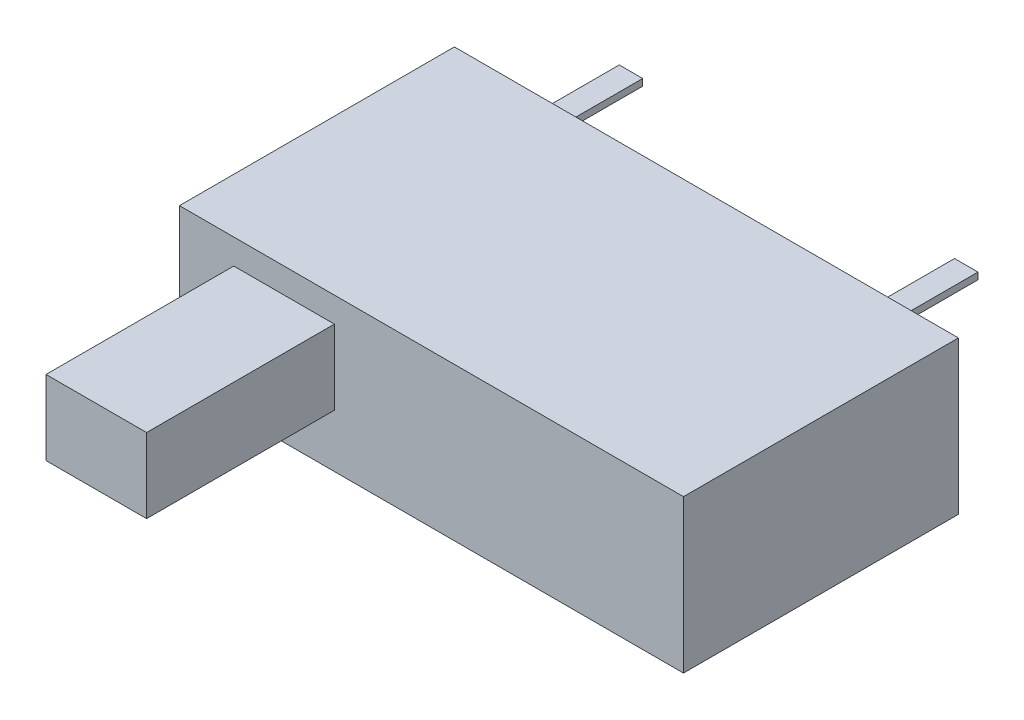
ISO-10303-21;
HEADER;
FILE_DESCRIPTION(('STEP AP214'),'2;1');
FILE_NAME('part.step','',(''),(''),'','','');
FILE_SCHEMA(('AUTOMOTIVE_DESIGN { 1 0 10303 214 1 1 1 1 }'));
ENDSEC;
DATA;
#1=APPLICATION_CONTEXT('core data for automotive mechanical design processes');
#2=APPLICATION_PROTOCOL_DEFINITION('international standard','automotive_design',2000,#1);
#3=PRODUCT_CONTEXT('',#1,'mechanical');
#4=PRODUCT('Part','Part','',(#3));
#5=PRODUCT_RELATED_PRODUCT_CATEGORY('part','',(#4));
#6=PRODUCT_DEFINITION_FORMATION('','',#4);
#7=PRODUCT_DEFINITION_CONTEXT('part definition',#1,'design');
#8=PRODUCT_DEFINITION('design','',#6,#7);
#9=PRODUCT_DEFINITION_SHAPE('','',#8);
#10=(LENGTH_UNIT() NAMED_UNIT(*) SI_UNIT(.MILLI.,.METRE.));
#11=(NAMED_UNIT(*) PLANE_ANGLE_UNIT() SI_UNIT($,.RADIAN.));
#12=(NAMED_UNIT(*) SI_UNIT($,.STERADIAN.) SOLID_ANGLE_UNIT());
#13=UNCERTAINTY_MEASURE_WITH_UNIT(LENGTH_MEASURE(1.E-05),#10,'distance_accuracy_value','');
#14=(GEOMETRIC_REPRESENTATION_CONTEXT(3) GLOBAL_UNCERTAINTY_ASSIGNED_CONTEXT((#13)) GLOBAL_UNIT_ASSIGNED_CONTEXT((#10,
#11,#12)) REPRESENTATION_CONTEXT('',''));
#15=CARTESIAN_POINT('',(0.,0.,0.));
#16=DIRECTION('',(0.,0.,1.));
#17=DIRECTION('',(1.,0.,0.));
#18=AXIS2_PLACEMENT_3D('',#15,#16,#17);
#19=CARTESIAN_POINT('',(13.4366000007917,29.2823899973672,-0.780745999724671));
#20=DIRECTION('',(-1.,5.89793348174388E-10,0.));
#21=DIRECTION('',(-5.89793348174388E-10,-1.,0.));
#22=AXIS2_PLACEMENT_3D('',#19,#20,#21);
#23=PLANE('',#22);
#24=DIRECTION('',(0.,-2.05103428515331E-10,1.));
#25=VECTOR('',#24,1.);
#26=CARTESIAN_POINT('',(13.4366000007917,29.2823899973671,-0.780745999724671));
#27=LINE('',#26,#25);
#28=CARTESIAN_POINT('',(13.4366000008217,29.2823899970806,2.01325400027533));
#29=VERTEX_POINT('',#28);
#30=CARTESIAN_POINT('',(13.4366000008217,29.2823899973672,-0.780745999703833));
#31=VERTEX_POINT('',#30);
#32=EDGE_CURVE('E155',#29,#31,#27,.F.);
#33=ORIENTED_EDGE('',*,*,#32,.T.);
#34=DIRECTION('',(0.,1.,2.05103428515331E-10));
#35=VECTOR('',#34,1.);
#36=CARTESIAN_POINT('',(13.4366000009116,29.4855899977866,-0.780745999682994));
#37=LINE('',#36,#35);
#38=CARTESIAN_POINT('',(13.4366000009116,29.4855899974336,-0.780745999682994));
#39=VERTEX_POINT('',#38);
#40=EDGE_CURVE('E149',#39,#31,#37,.F.);
#41=ORIENTED_EDGE('',*,*,#40,.F.);
#42=DIRECTION('',(0.,-2.05103428515331E-10,1.));
#43=VECTOR('',#42,1.);
#44=CARTESIAN_POINT('',(13.4366000009116,29.4855899973671,-0.780745999682994));
#45=LINE('',#44,#43);
#46=CARTESIAN_POINT('',(13.4366000009116,29.485589996899,2.01325400029617));
#47=VERTEX_POINT('',#46);
#48=EDGE_CURVE('E158',#39,#47,#45,.T.);
#49=ORIENTED_EDGE('',*,*,#48,.T.);
#50=DIRECTION('',(-5.89793348174388E-10,-1.,0.));
#51=VECTOR('',#50,1.);
#52=CARTESIAN_POINT('',(13.4366000007917,29.2823899973672,2.01325400027533));
#53=LINE('',#52,#51);
#54=EDGE_CURVE('E20',#29,#47,#53,.F.);
#55=ORIENTED_EDGE('',*,*,#54,.F.);
#56=EDGE_LOOP('',(#33,#41,#49,#55));
#57=FACE_BOUND('',#56,.T.);
#58=ADVANCED_FACE('F17',(#57),#23,.F.);
#59=CARTESIAN_POINT('',(3.27660000079173,29.2823900033595,-0.780745999724671));
#60=DIRECTION('',(-1.,5.89793348174388E-10,0.));
#61=DIRECTION('',(-5.89793348174388E-10,-1.,0.));
#62=AXIS2_PLACEMENT_3D('',#59,#60,#61);
#63=PLANE('',#62);
#64=DIRECTION('',(0.,-2.05103428515331E-10,1.));
#65=VECTOR('',#64,1.);
#66=CARTESIAN_POINT('',(3.27660000079173,29.2823900033594,-0.780745999724671));
#67=LINE('',#66,#65);
#68=CARTESIAN_POINT('',(3.27660000082169,29.2823900030729,2.01325400027533));
#69=VERTEX_POINT('',#68);
#70=CARTESIAN_POINT('',(3.27660000082169,29.2823900033595,-0.780745999703833));
#71=VERTEX_POINT('',#70);
#72=EDGE_CURVE('E211',#69,#71,#67,.F.);
#73=ORIENTED_EDGE('',*,*,#72,.T.);
#74=DIRECTION('',(0.,1.,2.05103428515331E-10));
#75=VECTOR('',#74,1.);
#76=CARTESIAN_POINT('',(3.27660000091158,29.4855900037789,-0.780745999682994));
#77=LINE('',#76,#75);
#78=CARTESIAN_POINT('',(3.27660000091158,29.4855900034259,-0.780745999682994));
#79=VERTEX_POINT('',#78);
#80=EDGE_CURVE('E201',#79,#71,#77,.F.);
#81=ORIENTED_EDGE('',*,*,#80,.F.);
#82=DIRECTION('',(0.,-2.05103428515331E-10,1.));
#83=VECTOR('',#82,1.);
#84=CARTESIAN_POINT('',(3.27660000091158,29.4855900033594,-0.780745999682994));
#85=LINE('',#84,#83);
#86=CARTESIAN_POINT('',(3.27660000091158,29.4855900028913,2.01325400029617));
#87=VERTEX_POINT('',#86);
#88=EDGE_CURVE('E193',#79,#87,#85,.T.);
#89=ORIENTED_EDGE('',*,*,#88,.T.);
#90=DIRECTION('',(-5.89793348174388E-10,-1.,0.));
#91=VECTOR('',#90,1.);
#92=CARTESIAN_POINT('',(3.27660000079173,29.2823900033595,2.01325400027533));
#93=LINE('',#92,#91);
#94=EDGE_CURVE('E162',#69,#87,#93,.F.);
#95=ORIENTED_EDGE('',*,*,#94,.F.);
#96=EDGE_LOOP('',(#73,#81,#89,#95));
#97=FACE_BOUND('',#96,.T.);
#98=ADVANCED_FACE('F200',(#97),#63,.F.);
#99=CARTESIAN_POINT('',(8.35659999908393,26.3867900003633,-0.780746000318568));
#100=DIRECTION('',(-1.,5.89793348174388E-10,0.));
#101=DIRECTION('',(-5.89793348174388E-10,-1.,0.));
#102=AXIS2_PLACEMENT_3D('',#99,#100,#101);
#103=PLANE('',#102);
#104=DIRECTION('',(0.,-2.05103428515331E-10,1.));
#105=VECTOR('',#104,1.);
#106=CARTESIAN_POINT('',(8.35659999908393,26.3867900003633,-0.780746000318568));
#107=LINE('',#106,#105);
#108=CARTESIAN_POINT('',(8.35659999911389,26.3867900000768,2.01325399968143));
#109=VERTEX_POINT('',#108);
#110=CARTESIAN_POINT('',(8.35659999911389,26.3867900003633,-0.78074600029773));
#111=VERTEX_POINT('',#110);
#112=EDGE_CURVE('E198',#109,#111,#107,.F.);
#113=ORIENTED_EDGE('',*,*,#112,.T.);
#114=DIRECTION('',(0.,1.,2.05103428515331E-10));
#115=VECTOR('',#114,1.);
#116=CARTESIAN_POINT('',(8.35659999920377,26.5899900007828,-0.780746000276892));
#117=LINE('',#116,#115);
#118=CARTESIAN_POINT('',(8.35659999920377,26.5899900004298,-0.780746000276892));
#119=VERTEX_POINT('',#118);
#120=EDGE_CURVE('E264',#119,#111,#117,.F.);
#121=ORIENTED_EDGE('',*,*,#120,.F.);
#122=DIRECTION('',(0.,-2.05103428515331E-10,1.));
#123=VECTOR('',#122,1.);
#124=CARTESIAN_POINT('',(8.35659999920377,26.5899900003633,-0.780746000276892));
#125=LINE('',#124,#123);
#126=CARTESIAN_POINT('',(8.35659999920377,26.5899899998951,2.01325399970227));
#127=VERTEX_POINT('',#126);
#128=EDGE_CURVE('E256',#119,#127,#125,.T.);
#129=ORIENTED_EDGE('',*,*,#128,.T.);
#130=DIRECTION('',(-5.89793348174388E-10,-1.,0.));
#131=VECTOR('',#130,1.);
#132=CARTESIAN_POINT('',(8.35659999908393,26.3867900003633,2.01325399968143));
#133=LINE('',#132,#131);
#134=EDGE_CURVE('E169',#109,#127,#133,.F.);
#135=ORIENTED_EDGE('',*,*,#134,.F.);
#136=EDGE_LOOP('',(#113,#121,#129,#135));
#137=FACE_BOUND('',#136,.T.);
#138=ADVANCED_FACE('F272',(#137),#103,.F.);
#139=CARTESIAN_POINT('',(2.01040999958279,27.2326100006575,16.0340539998549));
#140=DIRECTION('',(0.,-2.05103428515331E-10,1.));
#141=DIRECTION('',(0.,-1.,-2.05103428515331E-10));
#142=AXIS2_PLACEMENT_3D('',#139,#140,#141);
#143=PLANE('',#142);
#144=DIRECTION('',(-5.89793348174388E-10,-1.,0.));
#145=VECTOR('',#144,1.);
#146=CARTESIAN_POINT('',(5.05841000091607,29.4932099988598,16.0340539998549));
#147=LINE('',#146,#145);
#148=CARTESIAN_POINT('',(5.05840999958279,27.232609999601,16.0340539998549));
#149=VERTEX_POINT('',#148);
#150=CARTESIAN_POINT('',(5.05841000024943,29.4932099988598,16.0340540002027));
#151=VERTEX_POINT('',#150);
#152=EDGE_CURVE('E231',#149,#151,#147,.F.);
#153=ORIENTED_EDGE('',*,*,#152,.T.);
#154=DIRECTION('',(1.,-5.89793348174388E-10,0.));
#155=VECTOR('',#154,1.);
#156=CARTESIAN_POINT('',(2.01041000091607,29.4932100006575,16.0340540003186));
#157=LINE('',#156,#155);
#158=CARTESIAN_POINT('',(2.01041000091607,29.4932100000504,16.0340540003186));
#159=VERTEX_POINT('',#158);
#160=EDGE_CURVE('E243',#151,#159,#157,.F.);
#161=ORIENTED_EDGE('',*,*,#160,.T.);
#162=DIRECTION('',(5.89793348174388E-10,1.,0.));
#163=VECTOR('',#162,1.);
#164=CARTESIAN_POINT('',(2.01041000091607,29.4932100006575,16.0340540003186));
#165=LINE('',#164,#163);
#166=CARTESIAN_POINT('',(2.01041000024943,27.2326100006575,16.0340539999708));
#167=VERTEX_POINT('',#166);
#168=EDGE_CURVE('E249',#159,#167,#165,.F.);
#169=ORIENTED_EDGE('',*,*,#168,.T.);
#170=DIRECTION('',(-1.,5.89793241461576E-10,0.));
#171=VECTOR('',#170,1.);
#172=CARTESIAN_POINT('',(2.01040999958279,27.2326100006575,16.0340539998549));
#173=LINE('',#172,#171);
#174=EDGE_CURVE('E252',#167,#149,#173,.F.);
#175=ORIENTED_EDGE('',*,*,#174,.T.);
#176=EDGE_LOOP('',(#153,#161,#169,#175));
#177=FACE_BOUND('',#176,.T.);
#178=ADVANCED_FACE('F417',(#177),#143,.T.);
#179=CARTESIAN_POINT('',(12.7254000007917,29.2823899977866,-0.780745999724671));
#180=DIRECTION('',(5.89793348174388E-10,1.,2.05103428515331E-10));
#181=DIRECTION('',(-1.,5.89793348174388E-10,0.));
#182=AXIS2_PLACEMENT_3D('',#179,#180,#181);
#183=PLANE('',#182);
#184=DIRECTION('',(0.,0.,1.));
#185=VECTOR('',#184,1.);
#186=CARTESIAN_POINT('',(12.7254000007917,29.2823899972136,-0.780745999724671));
#187=LINE('',#186,#185);
#188=CARTESIAN_POINT('',(12.7254000007917,29.2823899971087,2.01325400028575));
#189=VERTEX_POINT('',#188);
#190=CARTESIAN_POINT('',(12.7254000007917,29.2823899975385,-0.780745999724671));
#191=VERTEX_POINT('',#190);
#192=EDGE_CURVE('E224',#189,#191,#187,.F.);
#193=ORIENTED_EDGE('',*,*,#192,.T.);
#194=DIRECTION('',(1.,0.,0.));
#195=VECTOR('',#194,1.);
#196=CARTESIAN_POINT('',(12.7254000009116,29.2823899973672,-0.780745999724671));
#197=LINE('',#196,#195);
#198=EDGE_CURVE('E168',#31,#191,#197,.F.);
#199=ORIENTED_EDGE('',*,*,#198,.F.);
#200=ORIENTED_EDGE('',*,*,#32,.F.);
#201=DIRECTION('',(-1.,5.89793348174388E-10,0.));
#202=VECTOR('',#201,1.);
#203=CARTESIAN_POINT('',(12.7254000007917,29.2823899972135,2.01325400027533));
#204=LINE('',#203,#202);
#205=EDGE_CURVE('E166',#189,#29,#204,.F.);
#206=ORIENTED_EDGE('',*,*,#205,.F.);
#207=EDGE_LOOP('',(#193,#199,#200,#206));
#208=FACE_BOUND('',#207,.T.);
#209=ADVANCED_FACE('F165',(#208),#183,.F.);
#210=CARTESIAN_POINT('',(12.7254000009116,29.4855899977866,-0.780745999682994));
#211=DIRECTION('',(0.,2.05103428515331E-10,-1.));
#212=DIRECTION('',(0.,1.,2.05103428515331E-10));
#213=AXIS2_PLACEMENT_3D('',#210,#211,#212);
#214=PLANE('',#213);
#215=ORIENTED_EDGE('',*,*,#40,.T.);
#216=ORIENTED_EDGE('',*,*,#198,.T.);
#217=DIRECTION('',(5.89793348174388E-10,1.,0.));
#218=VECTOR('',#217,1.);
#219=CARTESIAN_POINT('',(12.7254000007917,29.2823899977866,-0.780745999724671));
#220=LINE('',#219,#218);
#221=CARTESIAN_POINT('',(12.7254000008516,29.4855899977866,-0.780745999693413));
#222=VERTEX_POINT('',#221);
#223=EDGE_CURVE('E220',#191,#222,#220,.T.);
#224=ORIENTED_EDGE('',*,*,#223,.T.);
#225=DIRECTION('',(1.,-5.89793348174388E-10,0.));
#226=VECTOR('',#225,1.);
#227=CARTESIAN_POINT('',(12.7254000009116,29.4855899977866,-0.780745999682994));
#228=LINE('',#227,#226);
#229=EDGE_CURVE('E216',#222,#39,#228,.T.);
#230=ORIENTED_EDGE('',*,*,#229,.T.);
#231=EDGE_LOOP('',(#215,#216,#224,#230));
#232=FACE_BOUND('',#231,.T.);
#233=ADVANCED_FACE('F219',(#232),#214,.T.);
#234=CARTESIAN_POINT('',(12.7254000009116,29.4855899977866,-0.780745999682994));
#235=DIRECTION('',(-5.89793348174388E-10,-1.,-2.05103428515331E-10));
#236=DIRECTION('',(1.,-5.89793348174388E-10,0.));
#237=AXIS2_PLACEMENT_3D('',#234,#235,#236);
#238=PLANE('',#237);
#239=ORIENTED_EDGE('',*,*,#48,.F.);
#240=ORIENTED_EDGE('',*,*,#229,.F.);
#241=DIRECTION('',(0.,0.,1.));
#242=VECTOR('',#241,1.);
#243=CARTESIAN_POINT('',(12.7254000009115,29.4855899977866,-0.780745999724671));
#244=LINE('',#243,#242);
#245=CARTESIAN_POINT('',(12.7254000008816,29.4855899973568,2.01325400031701));
#246=VERTEX_POINT('',#245);
#247=EDGE_CURVE('E226',#222,#246,#244,.T.);
#248=ORIENTED_EDGE('',*,*,#247,.T.);
#249=DIRECTION('',(1.,-5.89793348174388E-10,0.));
#250=VECTOR('',#249,1.);
#251=CARTESIAN_POINT('',(12.7254000009116,29.4855899972135,2.01325400031701));
#252=LINE('',#251,#250);
#253=EDGE_CURVE('E213',#47,#246,#252,.F.);
#254=ORIENTED_EDGE('',*,*,#253,.F.);
#255=EDGE_LOOP('',(#239,#240,#248,#254));
#256=FACE_BOUND('',#255,.T.);
#257=ADVANCED_FACE('F304',(#256),#238,.F.);
#258=CARTESIAN_POINT('',(2.56540000079173,29.2823900037789,-0.780745999724671));
#259=DIRECTION('',(5.89793348174388E-10,1.,2.05103428515331E-10));
#260=DIRECTION('',(-1.,5.89793348174388E-10,0.));
#261=AXIS2_PLACEMENT_3D('',#258,#259,#260);
#262=PLANE('',#261);
#263=DIRECTION('',(0.,0.,1.));
#264=VECTOR('',#263,1.);
#265=CARTESIAN_POINT('',(2.56540000079173,29.2823900032059,-0.780745999724671));
#266=LINE('',#265,#264);
#267=CARTESIAN_POINT('',(2.56540000079173,29.282390003101,2.01325400028575));
#268=VERTEX_POINT('',#267);
#269=CARTESIAN_POINT('',(2.56540000079173,29.2823900035308,-0.780745999724671));
#270=VERTEX_POINT('',#269);
#271=EDGE_CURVE('E301',#268,#270,#266,.F.);
#272=ORIENTED_EDGE('',*,*,#271,.T.);
#273=DIRECTION('',(1.,0.,0.));
#274=VECTOR('',#273,1.);
#275=CARTESIAN_POINT('',(2.56540000091158,29.2823900033595,-0.780745999724671));
#276=LINE('',#275,#274);
#277=EDGE_CURVE('E204',#71,#270,#276,.F.);
#278=ORIENTED_EDGE('',*,*,#277,.F.);
#279=ORIENTED_EDGE('',*,*,#72,.F.);
#280=DIRECTION('',(-1.,5.89793348174388E-10,0.));
#281=VECTOR('',#280,1.);
#282=CARTESIAN_POINT('',(2.56540000079173,29.2823900032058,2.01325400027533));
#283=LINE('',#282,#281);
#284=EDGE_CURVE('E185',#268,#69,#283,.F.);
#285=ORIENTED_EDGE('',*,*,#284,.F.);
#286=EDGE_LOOP('',(#272,#278,#279,#285));
#287=FACE_BOUND('',#286,.T.);
#288=ADVANCED_FACE('F478',(#287),#262,.F.);
#289=CARTESIAN_POINT('',(2.56540000091158,29.4855900037789,-0.780745999682994));
#290=DIRECTION('',(0.,2.05103428515331E-10,-1.));
#291=DIRECTION('',(0.,1.,2.05103428515331E-10));
#292=AXIS2_PLACEMENT_3D('',#289,#290,#291);
#293=PLANE('',#292);
#294=ORIENTED_EDGE('',*,*,#80,.T.);
#295=ORIENTED_EDGE('',*,*,#277,.T.);
#296=DIRECTION('',(5.89793348174388E-10,1.,0.));
#297=VECTOR('',#296,1.);
#298=CARTESIAN_POINT('',(2.56540000079173,29.2823900037789,-0.780745999724671));
#299=LINE('',#298,#297);
#300=CARTESIAN_POINT('',(2.56540000085165,29.4855900037789,-0.780745999693413));
#301=VERTEX_POINT('',#300);
#302=EDGE_CURVE('E298',#270,#301,#299,.T.);
#303=ORIENTED_EDGE('',*,*,#302,.T.);
#304=DIRECTION('',(1.,-5.89793348174388E-10,0.));
#305=VECTOR('',#304,1.);
#306=CARTESIAN_POINT('',(2.56540000091158,29.4855900037789,-0.780745999682994));
#307=LINE('',#306,#305);
#308=EDGE_CURVE('E202',#301,#79,#307,.T.);
#309=ORIENTED_EDGE('',*,*,#308,.T.);
#310=EDGE_LOOP('',(#294,#295,#303,#309));
#311=FACE_BOUND('',#310,.T.);
#312=ADVANCED_FACE('F487',(#311),#293,.T.);
#313=CARTESIAN_POINT('',(2.56540000091158,29.4855900037789,-0.780745999682994));
#314=DIRECTION('',(-5.89793348174388E-10,-1.,-2.05103428515331E-10));
#315=DIRECTION('',(1.,-5.89793348174388E-10,0.));
#316=AXIS2_PLACEMENT_3D('',#313,#314,#315);
#317=PLANE('',#316);
#318=ORIENTED_EDGE('',*,*,#88,.F.);
#319=ORIENTED_EDGE('',*,*,#308,.F.);
#320=DIRECTION('',(0.,0.,1.));
#321=VECTOR('',#320,1.);
#322=CARTESIAN_POINT('',(2.56540000091158,29.4855900037789,-0.780745999724671));
#323=LINE('',#322,#321);
#324=CARTESIAN_POINT('',(2.56540000088162,29.4855900033491,2.01325400031701));
#325=VERTEX_POINT('',#324);
#326=EDGE_CURVE('E196',#301,#325,#323,.T.);
#327=ORIENTED_EDGE('',*,*,#326,.T.);
#328=DIRECTION('',(1.,-5.89793348174388E-10,0.));
#329=VECTOR('',#328,1.);
#330=CARTESIAN_POINT('',(2.56540000091158,29.4855900032058,2.01325400031701));
#331=LINE('',#330,#329);
#332=EDGE_CURVE('E183',#87,#325,#331,.F.);
#333=ORIENTED_EDGE('',*,*,#332,.F.);
#334=EDGE_LOOP('',(#318,#319,#327,#333));
#335=FACE_BOUND('',#334,.T.);
#336=ADVANCED_FACE('F192',(#335),#317,.F.);
#337=CARTESIAN_POINT('',(7.64539999908393,26.3867900007828,-0.780746000318568));
#338=DIRECTION('',(5.89793348174388E-10,1.,2.05103428515331E-10));
#339=DIRECTION('',(-1.,5.89793348174388E-10,0.));
#340=AXIS2_PLACEMENT_3D('',#337,#338,#339);
#341=PLANE('',#340);
#342=DIRECTION('',(0.,0.,1.));
#343=VECTOR('',#342,1.);
#344=CARTESIAN_POINT('',(7.64539999908393,26.3867900002097,-0.780746000318568));
#345=LINE('',#344,#343);
#346=CARTESIAN_POINT('',(7.64539999908393,26.3867900001049,2.01325399969185));
#347=VERTEX_POINT('',#346);
#348=CARTESIAN_POINT('',(7.64539999908393,26.3867900005346,-0.780746000318568));
#349=VERTEX_POINT('',#348);
#350=EDGE_CURVE('E278',#347,#349,#345,.F.);
#351=ORIENTED_EDGE('',*,*,#350,.T.);
#352=DIRECTION('',(1.,0.,0.));
#353=VECTOR('',#352,1.);
#354=CARTESIAN_POINT('',(7.64539999920377,26.3867900003633,-0.780746000318569));
#355=LINE('',#354,#353);
#356=EDGE_CURVE('E262',#111,#349,#355,.F.);
#357=ORIENTED_EDGE('',*,*,#356,.F.);
#358=ORIENTED_EDGE('',*,*,#112,.F.);
#359=DIRECTION('',(-1.,5.89793348174388E-10,0.));
#360=VECTOR('',#359,1.);
#361=CARTESIAN_POINT('',(7.64539999908393,26.3867900002097,2.01325399968143));
#362=LINE('',#361,#360);
#363=EDGE_CURVE('E266',#347,#109,#362,.F.);
#364=ORIENTED_EDGE('',*,*,#363,.F.);
#365=EDGE_LOOP('',(#351,#357,#358,#364));
#366=FACE_BOUND('',#365,.T.);
#367=ADVANCED_FACE('F276',(#366),#341,.F.);
#368=CARTESIAN_POINT('',(7.64539999920377,26.5899900007828,-0.780746000276892));
#369=DIRECTION('',(0.,2.05103428515331E-10,-1.));
#370=DIRECTION('',(0.,1.,2.05103428515331E-10));
#371=AXIS2_PLACEMENT_3D('',#368,#369,#370);
#372=PLANE('',#371);
#373=ORIENTED_EDGE('',*,*,#120,.T.);
#374=ORIENTED_EDGE('',*,*,#356,.T.);
#375=DIRECTION('',(5.89793348174388E-10,1.,0.));
#376=VECTOR('',#375,1.);
#377=CARTESIAN_POINT('',(7.64539999908393,26.3867900007828,-0.780746000318568));
#378=LINE('',#377,#376);
#379=CARTESIAN_POINT('',(7.64539999914385,26.5899900007828,-0.780746000287311));
#380=VERTEX_POINT('',#379);
#381=EDGE_CURVE('E283',#349,#380,#378,.T.);
#382=ORIENTED_EDGE('',*,*,#381,.T.);
#383=DIRECTION('',(1.,-5.89793348174388E-10,0.));
#384=VECTOR('',#383,1.);
#385=CARTESIAN_POINT('',(7.64539999920377,26.5899900007828,-0.780746000276892));
#386=LINE('',#385,#384);
#387=EDGE_CURVE('E259',#380,#119,#386,.T.);
#388=ORIENTED_EDGE('',*,*,#387,.T.);
#389=EDGE_LOOP('',(#373,#374,#382,#388));
#390=FACE_BOUND('',#389,.T.);
#391=ADVANCED_FACE('F282',(#390),#372,.T.);
#392=CARTESIAN_POINT('',(7.64539999920377,26.5899900007828,-0.780746000276892));
#393=DIRECTION('',(-5.89793348174388E-10,-1.,-2.05103428515331E-10));
#394=DIRECTION('',(1.,-5.89793348174388E-10,0.));
#395=AXIS2_PLACEMENT_3D('',#392,#393,#394);
#396=PLANE('',#395);
#397=ORIENTED_EDGE('',*,*,#128,.F.);
#398=ORIENTED_EDGE('',*,*,#387,.F.);
#399=DIRECTION('',(0.,0.,1.));
#400=VECTOR('',#399,1.);
#401=CARTESIAN_POINT('',(7.64539999920378,26.5899900007828,-0.780746000318568));
#402=LINE('',#401,#400);
#403=CARTESIAN_POINT('',(7.64539999917381,26.589990000353,2.01325399972311));
#404=VERTEX_POINT('',#403);
#405=EDGE_CURVE('E290',#380,#404,#402,.T.);
#406=ORIENTED_EDGE('',*,*,#405,.T.);
#407=DIRECTION('',(1.,-5.89793348174388E-10,0.));
#408=VECTOR('',#407,1.);
#409=CARTESIAN_POINT('',(7.64539999920377,26.5899900002097,2.01325399972311));
#410=LINE('',#409,#408);
#411=EDGE_CURVE('E254',#127,#404,#410,.F.);
#412=ORIENTED_EDGE('',*,*,#411,.F.);
#413=EDGE_LOOP('',(#397,#398,#406,#412));
#414=FACE_BOUND('',#413,.T.);
#415=ADVANCED_FACE('F361',(#414),#396,.F.);
#416=CARTESIAN_POINT('',(2.01040999958279,27.2326100006575,16.0340539998549));
#417=DIRECTION('',(5.89793241461576E-10,1.,2.05103428515331E-10));
#418=DIRECTION('',(-1.,5.89793241461576E-10,0.));
#419=AXIS2_PLACEMENT_3D('',#416,#417,#418);
#420=PLANE('',#419);
#421=DIRECTION('',(0.,0.,1.));
#422=VECTOR('',#421,1.);
#423=CARTESIAN_POINT('',(5.05840999958278,27.2326100000268,16.0340540003186));
#424=LINE('',#423,#422);
#425=CARTESIAN_POINT('',(5.05840999991611,27.2326100000268,10.3444539999708));
#426=VERTEX_POINT('',#425);
#427=EDGE_CURVE('E237',#426,#149,#424,.T.);
#428=ORIENTED_EDGE('',*,*,#427,.T.);
#429=ORIENTED_EDGE('',*,*,#174,.F.);
#430=DIRECTION('',(0.,0.,1.));
#431=VECTOR('',#430,1.);
#432=CARTESIAN_POINT('',(2.01040999958278,27.2326100006575,16.0340540003186));
#433=LINE('',#432,#431);
#434=CARTESIAN_POINT('',(2.01040999958279,27.2326100010833,10.3444539998549));
#435=VERTEX_POINT('',#434);
#436=EDGE_CURVE('E246',#167,#435,#433,.F.);
#437=ORIENTED_EDGE('',*,*,#436,.T.);
#438=DIRECTION('',(1.,0.,0.));
#439=VECTOR('',#438,1.);
#440=CARTESIAN_POINT('',(0.364489998634504,27.2326100000268,10.3444539998549));
#441=LINE('',#440,#439);
#442=EDGE_CURVE('E331',#426,#435,#441,.F.);
#443=ORIENTED_EDGE('',*,*,#442,.F.);
#444=EDGE_LOOP('',(#428,#429,#437,#443));
#445=FACE_BOUND('',#444,.T.);
#446=ADVANCED_FACE('F363',(#445),#420,.F.);
#447=CARTESIAN_POINT('',(2.01041000091607,29.4932100006575,16.0340540003186));
#448=DIRECTION('',(1.,-5.89793348174388E-10,0.));
#449=DIRECTION('',(5.89793348174388E-10,1.,0.));
#450=AXIS2_PLACEMENT_3D('',#447,#448,#449);
#451=PLANE('',#450);
#452=ORIENTED_EDGE('',*,*,#436,.F.);
#453=ORIENTED_EDGE('',*,*,#168,.F.);
#454=DIRECTION('',(0.,-2.05103428515331E-10,1.));
#455=VECTOR('',#454,1.);
#456=CARTESIAN_POINT('',(2.01041000091607,29.4932100006575,16.0340540003186));
#457=LINE('',#456,#455);
#458=CARTESIAN_POINT('',(2.01041000058275,29.4932100018245,10.3444540000867));
#459=VERTEX_POINT('',#458);
#460=EDGE_CURVE('E240',#159,#459,#457,.F.);
#461=ORIENTED_EDGE('',*,*,#460,.T.);
#462=DIRECTION('',(0.,-1.,-2.05103428515331E-10));
#463=VECTOR('',#462,1.);
#464=CARTESIAN_POINT('',(2.01040999958279,25.6247900027952,10.3444539995251));
#465=LINE('',#464,#463);
#466=EDGE_CURVE('E329',#435,#459,#465,.F.);
#467=ORIENTED_EDGE('',*,*,#466,.F.);
#468=EDGE_LOOP('',(#452,#453,#461,#467));
#469=FACE_BOUND('',#468,.T.);
#470=ADVANCED_FACE('F370',(#469),#451,.F.);
#471=CARTESIAN_POINT('',(2.01041000091607,29.4932100006575,16.0340540003186));
#472=DIRECTION('',(-5.89793348174388E-10,-1.,-2.05103428515331E-10));
#473=DIRECTION('',(1.,-5.89793348174388E-10,0.));
#474=AXIS2_PLACEMENT_3D('',#471,#472,#473);
#475=PLANE('',#474);
#476=ORIENTED_EDGE('',*,*,#460,.F.);
#477=ORIENTED_EDGE('',*,*,#160,.F.);
#478=DIRECTION('',(0.,0.,1.));
#479=VECTOR('',#478,1.);
#480=CARTESIAN_POINT('',(5.05841000091607,29.4932099988598,16.0340540003186));
#481=LINE('',#480,#479);
#482=CARTESIAN_POINT('',(5.05841000091607,29.4932100001845,10.3444540003186));
#483=VERTEX_POINT('',#482);
#484=EDGE_CURVE('E228',#151,#483,#481,.F.);
#485=ORIENTED_EDGE('',*,*,#484,.T.);
#486=DIRECTION('',(1.,0.,0.));
#487=VECTOR('',#486,1.);
#488=CARTESIAN_POINT('',(0.364489998634504,29.4932100018245,10.3444540003185));
#489=LINE('',#488,#487);
#490=EDGE_CURVE('E327',#459,#483,#489,.T.);
#491=ORIENTED_EDGE('',*,*,#490,.F.);
#492=EDGE_LOOP('',(#476,#477,#485,#491));
#493=FACE_BOUND('',#492,.T.);
#494=ADVANCED_FACE('F403',(#493),#475,.F.);
#495=CARTESIAN_POINT('',(5.05841000091607,29.4932099988598,16.0340540003186));
#496=DIRECTION('',(-1.,5.89793348174388E-10,0.));
#497=DIRECTION('',(-5.89793348174388E-10,-1.,0.));
#498=AXIS2_PLACEMENT_3D('',#495,#496,#497);
#499=PLANE('',#498);
#500=ORIENTED_EDGE('',*,*,#484,.F.);
#501=ORIENTED_EDGE('',*,*,#152,.F.);
#502=ORIENTED_EDGE('',*,*,#427,.F.);
#503=DIRECTION('',(0.,-1.,-2.05103428515331E-10));
#504=VECTOR('',#503,1.);
#505=CARTESIAN_POINT('',(5.05841000091607,25.6247900027952,10.3444539995251));
#506=LINE('',#505,#504);
#507=EDGE_CURVE('E324',#483,#426,#506,.T.);
#508=ORIENTED_EDGE('',*,*,#507,.F.);
#509=EDGE_LOOP('',(#500,#501,#502,#508));
#510=FACE_BOUND('',#509,.T.);
#511=ADVANCED_FACE('F400',(#510),#499,.F.);
#512=CARTESIAN_POINT('',(0.364489998634504,25.6247900027952,10.3444539995251));
#513=DIRECTION('',(5.89793348174388E-10,1.,2.05103428515331E-10));
#514=DIRECTION('',(-1.,5.89793348174388E-10,0.));
#515=AXIS2_PLACEMENT_3D('',#512,#513,#514);
#516=PLANE('',#515);
#517=DIRECTION('',(0.,0.,1.));
#518=VECTOR('',#517,1.);
#519=CARTESIAN_POINT('',(15.6375099986345,25.624789995496,10.3444540004749));
#520=LINE('',#519,#518);
#521=CARTESIAN_POINT('',(15.6375099986345,25.624789997748,2.01325399976257));
#522=VERTEX_POINT('',#521);
#523=CARTESIAN_POINT('',(15.6375099986345,25.6247899964664,10.3444539995251));
#524=VERTEX_POINT('',#523);
#525=EDGE_CURVE('E292',#522,#524,#520,.T.);
#526=ORIENTED_EDGE('',*,*,#525,.T.);
#527=DIRECTION('',(1.,0.,0.));
#528=VECTOR('',#527,1.);
#529=CARTESIAN_POINT('',(0.364489998634504,25.6247900027952,10.3444539995251));
#530=LINE('',#529,#528);
#531=CARTESIAN_POINT('',(0.364489999999999,25.6247900027952,10.3444539997625));
#532=VERTEX_POINT('',#531);
#533=EDGE_CURVE('E335',#532,#524,#530,.T.);
#534=ORIENTED_EDGE('',*,*,#533,.F.);
#535=DIRECTION('',(0.,0.,1.));
#536=VECTOR('',#535,1.);
#537=CARTESIAN_POINT('',(0.364489998634503,25.6247900027952,10.3444540004749));
#538=LINE('',#537,#536);
#539=CARTESIAN_POINT('',(0.364489999317251,25.6247900040768,2.01325399952514));
#540=VERTEX_POINT('',#539);
#541=EDGE_CURVE('E318',#532,#540,#538,.F.);
#542=ORIENTED_EDGE('',*,*,#541,.T.);
#543=DIRECTION('',(1.,0.,0.));
#544=VECTOR('',#543,1.);
#545=CARTESIAN_POINT('',(0.364489998634504,25.624790004504,2.01325399952514));
#546=LINE('',#545,#544);
#547=EDGE_CURVE('E315',#540,#522,#546,.T.);
#548=ORIENTED_EDGE('',*,*,#547,.T.);
#549=EDGE_LOOP('',(#526,#534,#542,#548));
#550=FACE_BOUND('',#549,.T.);
#551=ADVANCED_FACE('F339',(#550),#516,.F.);
#552=CARTESIAN_POINT('',(12.7254000007917,29.2823899977866,-0.780745999724671));
#553=DIRECTION('',(1.,-5.89793348174388E-10,0.));
#554=DIRECTION('',(5.89793348174388E-10,1.,0.));
#555=AXIS2_PLACEMENT_3D('',#552,#553,#554);
#556=PLANE('',#555);
#557=ORIENTED_EDGE('',*,*,#247,.F.);
#558=ORIENTED_EDGE('',*,*,#223,.F.);
#559=ORIENTED_EDGE('',*,*,#192,.F.);
#560=DIRECTION('',(0.,-1.,-2.05103428515331E-10));
#561=VECTOR('',#560,1.);
#562=CARTESIAN_POINT('',(12.7254000007917,25.624790004504,2.01325399952514));
#563=LINE('',#562,#561);
#564=EDGE_CURVE('E174',#189,#246,#563,.F.);
#565=ORIENTED_EDGE('',*,*,#564,.T.);
#566=EDGE_LOOP('',(#557,#558,#559,#565));
#567=FACE_BOUND('',#566,.T.);
#568=ADVANCED_FACE('F223',(#567),#556,.F.);
#569=CARTESIAN_POINT('',(2.56540000079173,29.2823900037789,-0.780745999724671));
#570=DIRECTION('',(1.,-5.89793348174388E-10,0.));
#571=DIRECTION('',(5.89793348174388E-10,1.,0.));
#572=AXIS2_PLACEMENT_3D('',#569,#570,#571);
#573=PLANE('',#572);
#574=ORIENTED_EDGE('',*,*,#326,.F.);
#575=ORIENTED_EDGE('',*,*,#302,.F.);
#576=ORIENTED_EDGE('',*,*,#271,.F.);
#577=DIRECTION('',(0.,-1.,-2.05103428515331E-10));
#578=VECTOR('',#577,1.);
#579=CARTESIAN_POINT('',(2.56540000079173,25.624790004504,2.01325399952514));
#580=LINE('',#579,#578);
#581=EDGE_CURVE('E305',#268,#325,#580,.F.);
#582=ORIENTED_EDGE('',*,*,#581,.T.);
#583=EDGE_LOOP('',(#574,#575,#576,#582));
#584=FACE_BOUND('',#583,.T.);
#585=ADVANCED_FACE('F392',(#584),#573,.F.);
#586=CARTESIAN_POINT('',(7.64539999908393,26.3867900007828,-0.780746000318568));
#587=DIRECTION('',(1.,-5.89793348174388E-10,0.));
#588=DIRECTION('',(5.89793348174388E-10,1.,0.));
#589=AXIS2_PLACEMENT_3D('',#586,#587,#588);
#590=PLANE('',#589);
#591=ORIENTED_EDGE('',*,*,#405,.F.);
#592=ORIENTED_EDGE('',*,*,#381,.F.);
#593=ORIENTED_EDGE('',*,*,#350,.F.);
#594=DIRECTION('',(0.,-1.,-2.05103428515331E-10));
#595=VECTOR('',#594,1.);
#596=CARTESIAN_POINT('',(7.64539999908393,25.624790004504,2.01325399952514));
#597=LINE('',#596,#595);
#598=EDGE_CURVE('E307',#347,#404,#597,.F.);
#599=ORIENTED_EDGE('',*,*,#598,.T.);
#600=EDGE_LOOP('',(#591,#592,#593,#599));
#601=FACE_BOUND('',#600,.T.);
#602=ADVANCED_FACE('F286',(#601),#590,.F.);
#603=CARTESIAN_POINT('',(15.6375100013655,30.2552099937873,10.3444540004749));
#604=DIRECTION('',(-1.,5.89793722810701E-10,0.));
#605=DIRECTION('',(-5.89793722810701E-10,-1.,0.));
#606=AXIS2_PLACEMENT_3D('',#603,#604,#605);
#607=PLANE('',#606);
#608=DIRECTION('',(0.,-2.05103428515331E-10,1.));
#609=VECTOR('',#608,1.);
#610=CARTESIAN_POINT('',(15.6375100013655,30.2552099937873,10.3444540004749));
#611=LINE('',#610,#609);
#612=CARTESIAN_POINT('',(15.6375100006828,30.2552099946417,2.01325400047486));
#613=VERTEX_POINT('',#612);
#614=CARTESIAN_POINT('',(15.6375100006828,30.2552099937873,10.344454));
#615=VERTEX_POINT('',#614);
#616=EDGE_CURVE('E345',#613,#615,#611,.T.);
#617=ORIENTED_EDGE('',*,*,#616,.T.);
#618=DIRECTION('',(0.,-1.,-2.05103428515331E-10));
#619=VECTOR('',#618,1.);
#620=CARTESIAN_POINT('',(15.6375099986345,25.6247900027952,10.3444539995251));
#621=LINE('',#620,#619);
#622=EDGE_CURVE('E333',#524,#615,#621,.F.);
#623=ORIENTED_EDGE('',*,*,#622,.F.);
#624=ORIENTED_EDGE('',*,*,#525,.F.);
#625=DIRECTION('',(0.,-1.,-2.05103428515331E-10));
#626=VECTOR('',#625,1.);
#627=CARTESIAN_POINT('',(15.6375099986345,25.624790004504,2.01325399952514));
#628=LINE('',#627,#626);
#629=EDGE_CURVE('E309',#522,#613,#628,.F.);
#630=ORIENTED_EDGE('',*,*,#629,.T.);
#631=EDGE_LOOP('',(#617,#623,#624,#630));
#632=FACE_BOUND('',#631,.T.);
#633=ADVANCED_FACE('F344',(#632),#607,.F.);
#634=CARTESIAN_POINT('',(0.364489998634504,25.6247900027952,10.3444539995251));
#635=DIRECTION('',(0.,-2.05103428515331E-10,1.));
#636=DIRECTION('',(0.,-1.,-2.05103428515331E-10));
#637=AXIS2_PLACEMENT_3D('',#634,#635,#636);
#638=PLANE('',#637);
#639=ORIENTED_EDGE('',*,*,#490,.T.);
#640=ORIENTED_EDGE('',*,*,#507,.T.);
#641=ORIENTED_EDGE('',*,*,#442,.T.);
#642=ORIENTED_EDGE('',*,*,#466,.T.);
#643=EDGE_LOOP('',(#639,#640,#641,#642));
#644=FACE_BOUND('',#643,.T.);
#645=ORIENTED_EDGE('',*,*,#622,.T.);
#646=DIRECTION('',(1.,-5.89793348174388E-10,0.));
#647=VECTOR('',#646,1.);
#648=CARTESIAN_POINT('',(0.364490001365494,30.2552100027952,10.3444540004749));
#649=LINE('',#648,#647);
#650=CARTESIAN_POINT('',(0.364490001365494,30.2552099987184,10.3444540004749));
#651=VERTEX_POINT('',#650);
#652=EDGE_CURVE('E350',#615,#651,#649,.F.);
#653=ORIENTED_EDGE('',*,*,#652,.T.);
#654=DIRECTION('',(5.89793348174388E-10,1.,0.));
#655=VECTOR('',#654,1.);
#656=CARTESIAN_POINT('',(0.364490001365494,30.2552100027952,10.3444540004749));
#657=LINE('',#656,#655);
#658=EDGE_CURVE('E321',#651,#532,#657,.F.);
#659=ORIENTED_EDGE('',*,*,#658,.T.);
#660=ORIENTED_EDGE('',*,*,#533,.T.);
#661=EDGE_LOOP('',(#645,#653,#659,#660));
#662=FACE_BOUND('',#661,.T.);
#663=ADVANCED_FACE('F349',(#644,#662),#638,.T.);
#664=CARTESIAN_POINT('',(0.364490001365494,30.2552100027952,10.3444540004749));
#665=DIRECTION('',(1.,-5.89793348174388E-10,0.));
#666=DIRECTION('',(5.89793348174388E-10,1.,0.));
#667=AXIS2_PLACEMENT_3D('',#664,#665,#666);
#668=PLANE('',#667);
#669=ORIENTED_EDGE('',*,*,#541,.F.);
#670=ORIENTED_EDGE('',*,*,#658,.F.);
#671=DIRECTION('',(0.,-2.05103428515331E-10,1.));
#672=VECTOR('',#671,1.);
#673=CARTESIAN_POINT('',(0.364490001365494,30.2552100027952,10.3444540004749));
#674=LINE('',#673,#672);
#675=CARTESIAN_POINT('',(0.364490001365494,30.255210002252,2.013254));
#676=VERTEX_POINT('',#675);
#677=EDGE_CURVE('E26',#651,#676,#674,.F.);
#678=ORIENTED_EDGE('',*,*,#677,.T.);
#679=DIRECTION('',(0.,-1.,-2.05103428515331E-10));
#680=VECTOR('',#679,1.);
#681=CARTESIAN_POINT('',(0.364490001365494,25.624790004504,2.01325399952514));
#682=LINE('',#681,#680);
#683=EDGE_CURVE('E34',#676,#540,#682,.T.);
#684=ORIENTED_EDGE('',*,*,#683,.T.);
#685=EDGE_LOOP('',(#669,#670,#678,#684));
#686=FACE_BOUND('',#685,.T.);
#687=ADVANCED_FACE('F379',(#686),#668,.F.);
#688=CARTESIAN_POINT('',(0.364489998634504,25.624790004504,2.01325399952514));
#689=DIRECTION('',(0.,-2.05103428515331E-10,1.));
#690=DIRECTION('',(0.,-1.,-2.05103428515331E-10));
#691=AXIS2_PLACEMENT_3D('',#688,#689,#690);
#692=PLANE('',#691);
#693=ORIENTED_EDGE('',*,*,#363,.T.);
#694=ORIENTED_EDGE('',*,*,#134,.T.);
#695=ORIENTED_EDGE('',*,*,#411,.T.);
#696=ORIENTED_EDGE('',*,*,#598,.F.);
#697=EDGE_LOOP('',(#693,#694,#695,#696));
#698=FACE_BOUND('',#697,.T.);
#699=ORIENTED_EDGE('',*,*,#284,.T.);
#700=ORIENTED_EDGE('',*,*,#94,.T.);
#701=ORIENTED_EDGE('',*,*,#332,.T.);
#702=ORIENTED_EDGE('',*,*,#581,.F.);
#703=EDGE_LOOP('',(#699,#700,#701,#702));
#704=FACE_BOUND('',#703,.T.);
#705=ORIENTED_EDGE('',*,*,#205,.T.);
#706=ORIENTED_EDGE('',*,*,#54,.T.);
#707=ORIENTED_EDGE('',*,*,#253,.T.);
#708=ORIENTED_EDGE('',*,*,#564,.F.);
#709=EDGE_LOOP('',(#705,#706,#707,#708));
#710=FACE_BOUND('',#709,.T.);
#711=DIRECTION('',(1.,-5.89793348174388E-10,0.));
#712=VECTOR('',#711,1.);
#713=CARTESIAN_POINT('',(0.364490001365494,30.255210004504,2.01325400047486));
#714=LINE('',#713,#712);
#715=EDGE_CURVE('E11',#676,#613,#714,.T.);
#716=ORIENTED_EDGE('',*,*,#715,.T.);
#717=ORIENTED_EDGE('',*,*,#629,.F.);
#718=ORIENTED_EDGE('',*,*,#547,.F.);
#719=ORIENTED_EDGE('',*,*,#683,.F.);
#720=EDGE_LOOP('',(#716,#717,#718,#719));
#721=FACE_BOUND('',#720,.T.);
#722=ADVANCED_FACE('F172',(#698,#704,#710,#721),#692,.F.);
#723=CARTESIAN_POINT('',(0.364490001365494,30.2552100027952,10.3444540004749));
#724=DIRECTION('',(-5.89793348174388E-10,-1.,-2.05103428515331E-10));
#725=DIRECTION('',(1.,-5.89793348174388E-10,0.));
#726=AXIS2_PLACEMENT_3D('',#723,#724,#725);
#727=PLANE('',#726);
#728=ORIENTED_EDGE('',*,*,#677,.F.);
#729=ORIENTED_EDGE('',*,*,#652,.F.);
#730=ORIENTED_EDGE('',*,*,#616,.F.);
#731=ORIENTED_EDGE('',*,*,#715,.F.);
#732=EDGE_LOOP('',(#728,#729,#730,#731));
#733=FACE_BOUND('',#732,.T.);
#734=ADVANCED_FACE('F353',(#733),#727,.F.);
#735=CLOSED_SHELL('',(#58,#98,#138,#178,#209,#233,#257,#288,#312,#336,#367,#391,#415,#446,#470,
#494,#511,#551,#568,#585,#602,#633,#663,#687,#722,#734));
#736=MANIFOLD_SOLID_BREP('B1',#735);
#737=ADVANCED_BREP_SHAPE_REPRESENTATION('',(#18,#736),#14);
#738=SHAPE_DEFINITION_REPRESENTATION(#9,#737);
ENDSEC;
END-ISO-10303-21;
